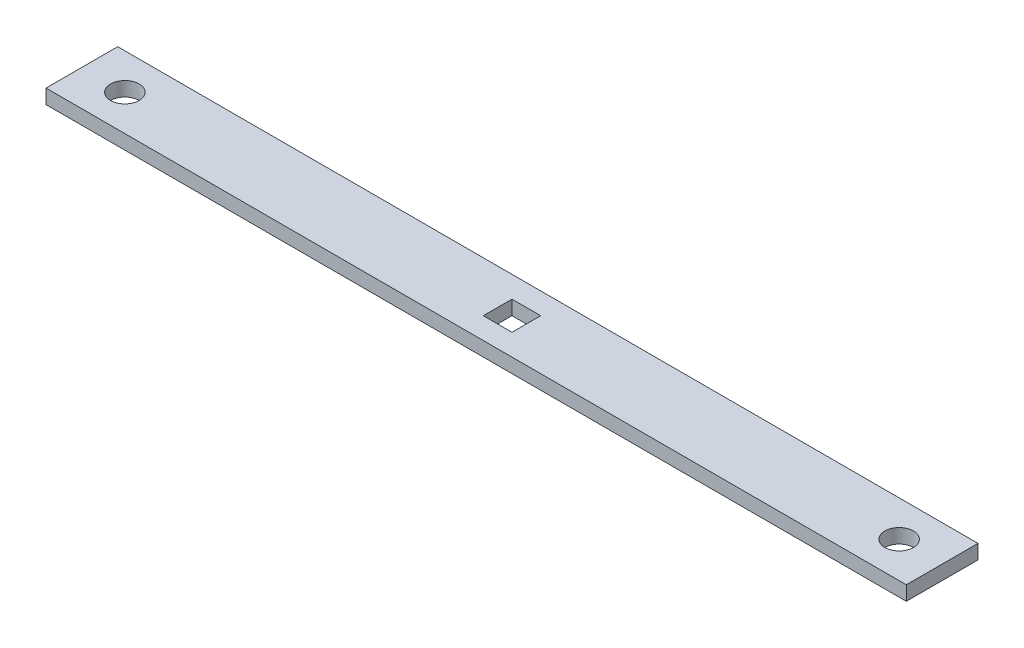
ISO-10303-21;
HEADER;
FILE_DESCRIPTION(('STEP AP214'),'2;1');
FILE_NAME('part.step','',(''),(''),'','','');
FILE_SCHEMA(('AUTOMOTIVE_DESIGN { 1 0 10303 214 1 1 1 1 }'));
ENDSEC;
DATA;
#1=APPLICATION_CONTEXT('core data for automotive mechanical design processes');
#2=APPLICATION_PROTOCOL_DEFINITION('international standard','automotive_design',2000,#1);
#3=PRODUCT_CONTEXT('',#1,'mechanical');
#4=PRODUCT('Part','Part','',(#3));
#5=PRODUCT_RELATED_PRODUCT_CATEGORY('part','',(#4));
#6=PRODUCT_DEFINITION_FORMATION('','',#4);
#7=PRODUCT_DEFINITION_CONTEXT('part definition',#1,'design');
#8=PRODUCT_DEFINITION('design','',#6,#7);
#9=PRODUCT_DEFINITION_SHAPE('','',#8);
#10=(LENGTH_UNIT() NAMED_UNIT(*) SI_UNIT(.MILLI.,.METRE.));
#11=(NAMED_UNIT(*) PLANE_ANGLE_UNIT() SI_UNIT($,.RADIAN.));
#12=(NAMED_UNIT(*) SI_UNIT($,.STERADIAN.) SOLID_ANGLE_UNIT());
#13=UNCERTAINTY_MEASURE_WITH_UNIT(LENGTH_MEASURE(1.E-05),#10,'distance_accuracy_value','');
#14=(GEOMETRIC_REPRESENTATION_CONTEXT(3) GLOBAL_UNCERTAINTY_ASSIGNED_CONTEXT((#13)) GLOBAL_UNIT_ASSIGNED_CONTEXT((#10,
#11,#12)) REPRESENTATION_CONTEXT('',''));
#15=CARTESIAN_POINT('',(0.,0.,0.));
#16=DIRECTION('',(0.,0.,1.));
#17=DIRECTION('',(1.,0.,0.));
#18=AXIS2_PLACEMENT_3D('',#15,#16,#17);
#19=CARTESIAN_POINT('',(15.,0.5,1.25));
#20=DIRECTION('',(-1.,0.,0.));
#21=DIRECTION('',(0.,0.,1.));
#22=AXIS2_PLACEMENT_3D('',#19,#20,#21);
#23=PLANE('',#22);
#24=DIRECTION('',(0.,0.,-1.));
#25=VECTOR('',#24,1.);
#26=CARTESIAN_POINT('',(15.,0.,1.25));
#27=LINE('',#26,#25);
#28=CARTESIAN_POINT('',(15.,0.,1.25));
#29=VERTEX_POINT('',#28);
#30=CARTESIAN_POINT('',(15.,0.,-1.25));
#31=VERTEX_POINT('',#30);
#32=EDGE_CURVE('E165',#29,#31,#27,.T.);
#33=ORIENTED_EDGE('',*,*,#32,.T.);
#34=DIRECTION('',(0.,-1.,0.));
#35=VECTOR('',#34,1.);
#36=CARTESIAN_POINT('',(15.,0.5,-1.25));
#37=LINE('',#36,#35);
#38=CARTESIAN_POINT('',(15.,0.5,-1.25));
#39=VERTEX_POINT('',#38);
#40=EDGE_CURVE('E11',#39,#31,#37,.T.);
#41=ORIENTED_EDGE('',*,*,#40,.F.);
#42=DIRECTION('',(0.,0.,-1.));
#43=VECTOR('',#42,1.);
#44=CARTESIAN_POINT('',(15.,0.5,1.25));
#45=LINE('',#44,#43);
#46=CARTESIAN_POINT('',(15.,0.5,1.25));
#47=VERTEX_POINT('',#46);
#48=EDGE_CURVE('E166',#47,#39,#45,.T.);
#49=ORIENTED_EDGE('',*,*,#48,.F.);
#50=DIRECTION('',(0.,-1.,0.));
#51=VECTOR('',#50,1.);
#52=CARTESIAN_POINT('',(15.,0.5,1.25));
#53=LINE('',#52,#51);
#54=EDGE_CURVE('E180',#47,#29,#53,.T.);
#55=ORIENTED_EDGE('',*,*,#54,.T.);
#56=EDGE_LOOP('',(#33,#41,#49,#55));
#57=FACE_BOUND('',#56,.T.);
#58=ADVANCED_FACE('F38',(#57),#23,.F.);
#59=CARTESIAN_POINT('',(-15.,0.5,-1.25));
#60=DIRECTION('',(0.,0.,1.));
#61=DIRECTION('',(1.,0.,0.));
#62=AXIS2_PLACEMENT_3D('',#59,#60,#61);
#63=PLANE('',#62);
#64=DIRECTION('',(-1.,0.,0.));
#65=VECTOR('',#64,1.);
#66=CARTESIAN_POINT('',(-15.,0.,-1.25));
#67=LINE('',#66,#65);
#68=CARTESIAN_POINT('',(-15.,0.,-1.25));
#69=VERTEX_POINT('',#68);
#70=EDGE_CURVE('E184',#31,#69,#67,.T.);
#71=ORIENTED_EDGE('',*,*,#70,.T.);
#72=DIRECTION('',(0.,-1.,0.));
#73=VECTOR('',#72,1.);
#74=CARTESIAN_POINT('',(-15.,0.5,-1.25));
#75=LINE('',#74,#73);
#76=CARTESIAN_POINT('',(-15.,0.5,-1.25));
#77=VERTEX_POINT('',#76);
#78=EDGE_CURVE('E46',#77,#69,#75,.T.);
#79=ORIENTED_EDGE('',*,*,#78,.F.);
#80=DIRECTION('',(-1.,0.,0.));
#81=VECTOR('',#80,1.);
#82=CARTESIAN_POINT('',(-15.,0.5,-1.25));
#83=LINE('',#82,#81);
#84=EDGE_CURVE('E170',#39,#77,#83,.T.);
#85=ORIENTED_EDGE('',*,*,#84,.F.);
#86=ORIENTED_EDGE('',*,*,#40,.T.);
#87=EDGE_LOOP('',(#71,#79,#85,#86));
#88=FACE_BOUND('',#87,.T.);
#89=ADVANCED_FACE('F218',(#88),#63,.F.);
#90=CARTESIAN_POINT('',(-15.,0.5,1.25));
#91=DIRECTION('',(1.,0.,0.));
#92=DIRECTION('',(0.,0.,-1.));
#93=AXIS2_PLACEMENT_3D('',#90,#91,#92);
#94=PLANE('',#93);
#95=DIRECTION('',(0.,0.,1.));
#96=VECTOR('',#95,1.);
#97=CARTESIAN_POINT('',(-15.,0.,1.25));
#98=LINE('',#97,#96);
#99=CARTESIAN_POINT('',(-15.,0.,1.25));
#100=VERTEX_POINT('',#99);
#101=EDGE_CURVE('E187',#69,#100,#98,.T.);
#102=ORIENTED_EDGE('',*,*,#101,.T.);
#103=DIRECTION('',(0.,-1.,0.));
#104=VECTOR('',#103,1.);
#105=CARTESIAN_POINT('',(-15.,0.5,1.25));
#106=LINE('',#105,#104);
#107=CARTESIAN_POINT('',(-15.,0.5,1.25));
#108=VERTEX_POINT('',#107);
#109=EDGE_CURVE('E195',#108,#100,#106,.T.);
#110=ORIENTED_EDGE('',*,*,#109,.F.);
#111=DIRECTION('',(0.,0.,1.));
#112=VECTOR('',#111,1.);
#113=CARTESIAN_POINT('',(-15.,0.5,1.25));
#114=LINE('',#113,#112);
#115=EDGE_CURVE('E174',#77,#108,#114,.T.);
#116=ORIENTED_EDGE('',*,*,#115,.F.);
#117=ORIENTED_EDGE('',*,*,#78,.T.);
#118=EDGE_LOOP('',(#102,#110,#116,#117));
#119=FACE_BOUND('',#118,.T.);
#120=ADVANCED_FACE('F204',(#119),#94,.F.);
#121=CARTESIAN_POINT('',(-15.,0.5,1.25));
#122=DIRECTION('',(0.,0.,-1.));
#123=DIRECTION('',(-1.,0.,0.));
#124=AXIS2_PLACEMENT_3D('',#121,#122,#123);
#125=PLANE('',#124);
#126=DIRECTION('',(1.,0.,0.));
#127=VECTOR('',#126,1.);
#128=CARTESIAN_POINT('',(-15.,0.,1.25));
#129=LINE('',#128,#127);
#130=EDGE_CURVE('E171',#100,#29,#129,.T.);
#131=ORIENTED_EDGE('',*,*,#130,.T.);
#132=ORIENTED_EDGE('',*,*,#54,.F.);
#133=DIRECTION('',(1.,0.,0.));
#134=VECTOR('',#133,1.);
#135=CARTESIAN_POINT('',(-15.,0.5,1.25));
#136=LINE('',#135,#134);
#137=EDGE_CURVE('E177',#108,#47,#136,.T.);
#138=ORIENTED_EDGE('',*,*,#137,.F.);
#139=ORIENTED_EDGE('',*,*,#109,.T.);
#140=EDGE_LOOP('',(#131,#132,#138,#139));
#141=FACE_BOUND('',#140,.T.);
#142=ADVANCED_FACE('F211',(#141),#125,.F.);
#143=CARTESIAN_POINT('',(0.,0.5,0.));
#144=DIRECTION('',(0.,-1.,0.));
#145=DIRECTION('',(0.,0.,-1.));
#146=AXIS2_PLACEMENT_3D('',#143,#144,#145);
#147=PLANE('',#146);
#148=CARTESIAN_POINT('',(-13.5,0.5,0.));
#149=DIRECTION('',(0.,-1.,0.));
#150=DIRECTION('',(0.,0.,-1.));
#151=AXIS2_PLACEMENT_3D('',#148,#149,#150);
#152=CIRCLE('',#151,0.499999999999999);
#153=CARTESIAN_POINT('',(-13.5,0.5,-0.499999999999999));
#154=VERTEX_POINT('',#153);
#155=EDGE_CURVE('E161',#154,#154,#152,.T.);
#156=ORIENTED_EDGE('',*,*,#155,.T.);
#157=EDGE_LOOP('',(#156));
#158=FACE_BOUND('',#157,.T.);
#159=CARTESIAN_POINT('',(13.5,0.5,0.));
#160=DIRECTION('',(0.,-1.,0.));
#161=DIRECTION('',(0.,0.,-1.));
#162=AXIS2_PLACEMENT_3D('',#159,#160,#161);
#163=CIRCLE('',#162,0.500000000000001);
#164=CARTESIAN_POINT('',(13.5,0.5,-0.500000000000001));
#165=VERTEX_POINT('',#164);
#166=EDGE_CURVE('E157',#165,#165,#163,.T.);
#167=ORIENTED_EDGE('',*,*,#166,.T.);
#168=EDGE_LOOP('',(#167));
#169=FACE_BOUND('',#168,.T.);
#170=DIRECTION('',(1.,0.,0.));
#171=VECTOR('',#170,1.);
#172=CARTESIAN_POINT('',(0.,0.5,-0.5));
#173=LINE('',#172,#171);
#174=CARTESIAN_POINT('',(-0.5,0.5,-0.5));
#175=VERTEX_POINT('',#174);
#176=CARTESIAN_POINT('',(0.5,0.5,-0.5));
#177=VERTEX_POINT('',#176);
#178=EDGE_CURVE('E143',#175,#177,#173,.T.);
#179=ORIENTED_EDGE('',*,*,#178,.T.);
#180=DIRECTION('',(0.,0.,1.));
#181=VECTOR('',#180,1.);
#182=CARTESIAN_POINT('',(0.5,0.5,0.));
#183=LINE('',#182,#181);
#184=CARTESIAN_POINT('',(0.5,0.5,0.5));
#185=VERTEX_POINT('',#184);
#186=EDGE_CURVE('E109',#177,#185,#183,.T.);
#187=ORIENTED_EDGE('',*,*,#186,.T.);
#188=DIRECTION('',(-1.,0.,0.));
#189=VECTOR('',#188,1.);
#190=CARTESIAN_POINT('',(0.,0.5,0.5));
#191=LINE('',#190,#189);
#192=CARTESIAN_POINT('',(-0.5,0.5,0.5));
#193=VERTEX_POINT('',#192);
#194=EDGE_CURVE('E151',#185,#193,#191,.T.);
#195=ORIENTED_EDGE('',*,*,#194,.T.);
#196=DIRECTION('',(0.,0.,-1.));
#197=VECTOR('',#196,1.);
#198=CARTESIAN_POINT('',(-0.5,0.5,0.));
#199=LINE('',#198,#197);
#200=EDGE_CURVE('E146',#193,#175,#199,.T.);
#201=ORIENTED_EDGE('',*,*,#200,.T.);
#202=EDGE_LOOP('',(#179,#187,#195,#201));
#203=FACE_BOUND('',#202,.T.);
#204=ORIENTED_EDGE('',*,*,#48,.T.);
#205=ORIENTED_EDGE('',*,*,#84,.T.);
#206=ORIENTED_EDGE('',*,*,#115,.T.);
#207=ORIENTED_EDGE('',*,*,#137,.T.);
#208=EDGE_LOOP('',(#204,#205,#206,#207));
#209=FACE_BOUND('',#208,.T.);
#210=ADVANCED_FACE('F217',(#158,#169,#203,#209),#147,.F.);
#211=CARTESIAN_POINT('',(0.,0.,0.));
#212=DIRECTION('',(0.,-1.,0.));
#213=DIRECTION('',(0.,0.,-1.));
#214=AXIS2_PLACEMENT_3D('',#211,#212,#213);
#215=PLANE('',#214);
#216=CARTESIAN_POINT('',(-13.5,0.,0.));
#217=DIRECTION('',(0.,1.,0.));
#218=DIRECTION('',(0.,0.,1.));
#219=AXIS2_PLACEMENT_3D('',#216,#217,#218);
#220=CIRCLE('',#219,0.499999999999999);
#221=CARTESIAN_POINT('',(-13.5,0.,0.499999999999999));
#222=VERTEX_POINT('',#221);
#223=EDGE_CURVE('E147',#222,#222,#220,.T.);
#224=ORIENTED_EDGE('',*,*,#223,.T.);
#225=EDGE_LOOP('',(#224));
#226=FACE_BOUND('',#225,.T.);
#227=CARTESIAN_POINT('',(13.5,0.,0.));
#228=DIRECTION('',(0.,1.,0.));
#229=DIRECTION('',(0.,0.,1.));
#230=AXIS2_PLACEMENT_3D('',#227,#228,#229);
#231=CIRCLE('',#230,0.500000000000001);
#232=CARTESIAN_POINT('',(13.5,0.,0.500000000000001));
#233=VERTEX_POINT('',#232);
#234=EDGE_CURVE('E127',#233,#233,#231,.T.);
#235=ORIENTED_EDGE('',*,*,#234,.T.);
#236=EDGE_LOOP('',(#235));
#237=FACE_BOUND('',#236,.T.);
#238=DIRECTION('',(0.,0.,-1.));
#239=VECTOR('',#238,1.);
#240=CARTESIAN_POINT('',(0.5,0.,0.5));
#241=LINE('',#240,#239);
#242=CARTESIAN_POINT('',(0.5,0.,0.5));
#243=VERTEX_POINT('',#242);
#244=CARTESIAN_POINT('',(0.5,0.,-0.5));
#245=VERTEX_POINT('',#244);
#246=EDGE_CURVE('E106',#243,#245,#241,.T.);
#247=ORIENTED_EDGE('',*,*,#246,.T.);
#248=DIRECTION('',(-1.,0.,0.));
#249=VECTOR('',#248,1.);
#250=CARTESIAN_POINT('',(-0.5,0.,-0.5));
#251=LINE('',#250,#249);
#252=CARTESIAN_POINT('',(-0.5,0.,-0.5));
#253=VERTEX_POINT('',#252);
#254=EDGE_CURVE('E116',#245,#253,#251,.T.);
#255=ORIENTED_EDGE('',*,*,#254,.T.);
#256=DIRECTION('',(0.,0.,1.));
#257=VECTOR('',#256,1.);
#258=CARTESIAN_POINT('',(-0.5,0.,0.5));
#259=LINE('',#258,#257);
#260=CARTESIAN_POINT('',(-0.5,0.,0.5));
#261=VERTEX_POINT('',#260);
#262=EDGE_CURVE('E61',#253,#261,#259,.T.);
#263=ORIENTED_EDGE('',*,*,#262,.T.);
#264=DIRECTION('',(1.,0.,0.));
#265=VECTOR('',#264,1.);
#266=CARTESIAN_POINT('',(-0.5,0.,0.5));
#267=LINE('',#266,#265);
#268=EDGE_CURVE('E113',#261,#243,#267,.T.);
#269=ORIENTED_EDGE('',*,*,#268,.T.);
#270=EDGE_LOOP('',(#247,#255,#263,#269));
#271=FACE_BOUND('',#270,.T.);
#272=ORIENTED_EDGE('',*,*,#32,.F.);
#273=ORIENTED_EDGE('',*,*,#130,.F.);
#274=ORIENTED_EDGE('',*,*,#101,.F.);
#275=ORIENTED_EDGE('',*,*,#70,.F.);
#276=EDGE_LOOP('',(#272,#273,#274,#275));
#277=FACE_BOUND('',#276,.T.);
#278=ADVANCED_FACE('F121',(#226,#237,#271,#277),#215,.T.);
#279=CARTESIAN_POINT('',(0.5,0.,0.5));
#280=DIRECTION('',(1.,0.,0.));
#281=DIRECTION('',(0.,0.,-1.));
#282=AXIS2_PLACEMENT_3D('',#279,#280,#281);
#283=PLANE('',#282);
#284=DIRECTION('',(0.,1.,0.));
#285=VECTOR('',#284,1.);
#286=CARTESIAN_POINT('',(0.5,0.,-0.5));
#287=LINE('',#286,#285);
#288=EDGE_CURVE('E53',#245,#177,#287,.T.);
#289=ORIENTED_EDGE('',*,*,#288,.F.);
#290=ORIENTED_EDGE('',*,*,#246,.F.);
#291=DIRECTION('',(0.,1.,0.));
#292=VECTOR('',#291,1.);
#293=CARTESIAN_POINT('',(0.5,0.,0.5));
#294=LINE('',#293,#292);
#295=EDGE_CURVE('E134',#243,#185,#294,.T.);
#296=ORIENTED_EDGE('',*,*,#295,.T.);
#297=ORIENTED_EDGE('',*,*,#186,.F.);
#298=EDGE_LOOP('',(#289,#290,#296,#297));
#299=FACE_BOUND('',#298,.T.);
#300=ADVANCED_FACE('F103',(#299),#283,.F.);
#301=CARTESIAN_POINT('',(-0.5,0.,0.5));
#302=DIRECTION('',(0.,0.,1.));
#303=DIRECTION('',(1.,0.,0.));
#304=AXIS2_PLACEMENT_3D('',#301,#302,#303);
#305=PLANE('',#304);
#306=ORIENTED_EDGE('',*,*,#295,.F.);
#307=ORIENTED_EDGE('',*,*,#268,.F.);
#308=DIRECTION('',(0.,1.,0.));
#309=VECTOR('',#308,1.);
#310=CARTESIAN_POINT('',(-0.5,0.,0.5));
#311=LINE('',#310,#309);
#312=EDGE_CURVE('E137',#261,#193,#311,.T.);
#313=ORIENTED_EDGE('',*,*,#312,.T.);
#314=ORIENTED_EDGE('',*,*,#194,.F.);
#315=EDGE_LOOP('',(#306,#307,#313,#314));
#316=FACE_BOUND('',#315,.T.);
#317=ADVANCED_FACE('F236',(#316),#305,.F.);
#318=CARTESIAN_POINT('',(-0.5,0.,0.5));
#319=DIRECTION('',(-1.,0.,0.));
#320=DIRECTION('',(0.,0.,1.));
#321=AXIS2_PLACEMENT_3D('',#318,#319,#320);
#322=PLANE('',#321);
#323=ORIENTED_EDGE('',*,*,#312,.F.);
#324=ORIENTED_EDGE('',*,*,#262,.F.);
#325=DIRECTION('',(0.,1.,0.));
#326=VECTOR('',#325,1.);
#327=CARTESIAN_POINT('',(-0.5,0.,-0.5));
#328=LINE('',#327,#326);
#329=EDGE_CURVE('E112',#253,#175,#328,.T.);
#330=ORIENTED_EDGE('',*,*,#329,.T.);
#331=ORIENTED_EDGE('',*,*,#200,.F.);
#332=EDGE_LOOP('',(#323,#324,#330,#331));
#333=FACE_BOUND('',#332,.T.);
#334=ADVANCED_FACE('F240',(#333),#322,.F.);
#335=CARTESIAN_POINT('',(-0.5,0.,-0.5));
#336=DIRECTION('',(0.,0.,-1.));
#337=DIRECTION('',(-1.,0.,0.));
#338=AXIS2_PLACEMENT_3D('',#335,#336,#337);
#339=PLANE('',#338);
#340=ORIENTED_EDGE('',*,*,#329,.F.);
#341=ORIENTED_EDGE('',*,*,#254,.F.);
#342=ORIENTED_EDGE('',*,*,#288,.T.);
#343=ORIENTED_EDGE('',*,*,#178,.F.);
#344=EDGE_LOOP('',(#340,#341,#342,#343));
#345=FACE_BOUND('',#344,.T.);
#346=ADVANCED_FACE('F117',(#345),#339,.F.);
#347=CARTESIAN_POINT('',(13.5,0.,0.));
#348=DIRECTION('',(0.,1.,0.));
#349=DIRECTION('',(0.,0.,1.));
#350=AXIS2_PLACEMENT_3D('',#347,#348,#349);
#351=CYLINDRICAL_SURFACE('',#350,0.500000000000001);
#352=ORIENTED_EDGE('',*,*,#234,.F.);
#353=EDGE_LOOP('',(#352));
#354=FACE_BOUND('',#353,.T.);
#355=ORIENTED_EDGE('',*,*,#166,.F.);
#356=EDGE_LOOP('',(#355));
#357=FACE_BOUND('',#356,.T.);
#358=ADVANCED_FACE('F239',(#354,#357),#351,.F.);
#359=CARTESIAN_POINT('',(-13.5,0.,0.));
#360=DIRECTION('',(0.,1.,0.));
#361=DIRECTION('',(0.,0.,1.));
#362=AXIS2_PLACEMENT_3D('',#359,#360,#361);
#363=CYLINDRICAL_SURFACE('',#362,0.499999999999999);
#364=ORIENTED_EDGE('',*,*,#223,.F.);
#365=EDGE_LOOP('',(#364));
#366=FACE_BOUND('',#365,.T.);
#367=ORIENTED_EDGE('',*,*,#155,.F.);
#368=EDGE_LOOP('',(#367));
#369=FACE_BOUND('',#368,.T.);
#370=ADVANCED_FACE('F248',(#366,#369),#363,.F.);
#371=CLOSED_SHELL('',(#58,#89,#120,#142,#210,#278,#300,#317,#334,#346,#358,#370));
#372=MANIFOLD_SOLID_BREP('B2',#371);
#373=ADVANCED_BREP_SHAPE_REPRESENTATION('',(#18,#372),#14);
#374=SHAPE_DEFINITION_REPRESENTATION(#9,#373);
ENDSEC;
END-ISO-10303-21;
